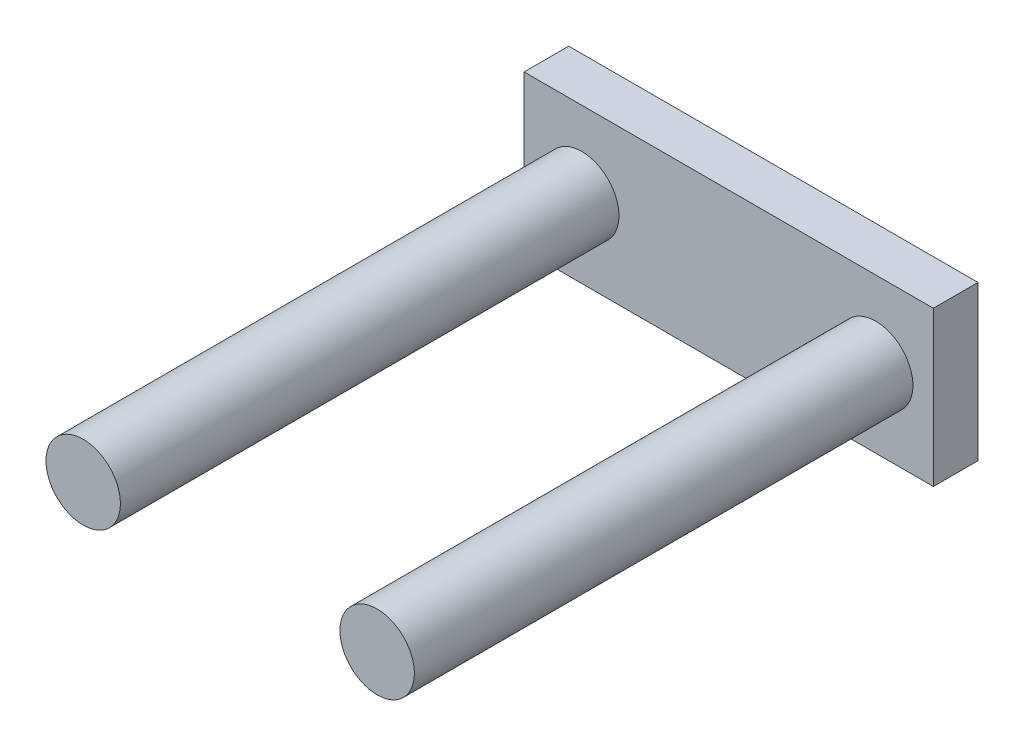
ISO-10303-21;
HEADER;
FILE_DESCRIPTION(('STEP AP214'),'2;1');
FILE_NAME('part.step','',(''),(''),'','','');
FILE_SCHEMA(('AUTOMOTIVE_DESIGN { 1 0 10303 214 1 1 1 1 }'));
ENDSEC;
DATA;
#1=APPLICATION_CONTEXT('core data for automotive mechanical design processes');
#2=APPLICATION_PROTOCOL_DEFINITION('international standard','automotive_design',2000,#1);
#3=PRODUCT_CONTEXT('',#1,'mechanical');
#4=PRODUCT('Part','Part','',(#3));
#5=PRODUCT_RELATED_PRODUCT_CATEGORY('part','',(#4));
#6=PRODUCT_DEFINITION_FORMATION('','',#4);
#7=PRODUCT_DEFINITION_CONTEXT('part definition',#1,'design');
#8=PRODUCT_DEFINITION('design','',#6,#7);
#9=PRODUCT_DEFINITION_SHAPE('','',#8);
#10=(LENGTH_UNIT() NAMED_UNIT(*) SI_UNIT(.MILLI.,.METRE.));
#11=(NAMED_UNIT(*) PLANE_ANGLE_UNIT() SI_UNIT($,.RADIAN.));
#12=(NAMED_UNIT(*) SI_UNIT($,.STERADIAN.) SOLID_ANGLE_UNIT());
#13=UNCERTAINTY_MEASURE_WITH_UNIT(LENGTH_MEASURE(1.E-05),#10,'distance_accuracy_value','');
#14=(GEOMETRIC_REPRESENTATION_CONTEXT(3) GLOBAL_UNCERTAINTY_ASSIGNED_CONTEXT((#13)) GLOBAL_UNIT_ASSIGNED_CONTEXT((#10,
#11,#12)) REPRESENTATION_CONTEXT('',''));
#15=CARTESIAN_POINT('',(0.,0.,0.));
#16=DIRECTION('',(0.,0.,1.));
#17=DIRECTION('',(1.,0.,0.));
#18=AXIS2_PLACEMENT_3D('',#15,#16,#17);
#19=CARTESIAN_POINT('',(55.,-20.75,12.));
#20=DIRECTION('',(-1.,0.,0.));
#21=DIRECTION('',(0.,0.,1.));
#22=AXIS2_PLACEMENT_3D('',#19,#20,#21);
#23=PLANE('',#22);
#24=DIRECTION('',(0.,1.,0.));
#25=VECTOR('',#24,1.);
#26=CARTESIAN_POINT('',(55.,-20.75,0.));
#27=LINE('',#26,#25);
#28=CARTESIAN_POINT('',(55.,-20.75,0.));
#29=VERTEX_POINT('',#28);
#30=CARTESIAN_POINT('',(55.,20.75,0.));
#31=VERTEX_POINT('',#30);
#32=EDGE_CURVE('E100',#29,#31,#27,.T.);
#33=ORIENTED_EDGE('',*,*,#32,.T.);
#34=DIRECTION('',(0.,0.,-1.));
#35=VECTOR('',#34,1.);
#36=CARTESIAN_POINT('',(55.,20.75,12.));
#37=LINE('',#36,#35);
#38=CARTESIAN_POINT('',(55.,20.75,12.));
#39=VERTEX_POINT('',#38);
#40=EDGE_CURVE('E91',#39,#31,#37,.T.);
#41=ORIENTED_EDGE('',*,*,#40,.F.);
#42=DIRECTION('',(0.,1.,0.));
#43=VECTOR('',#42,1.);
#44=CARTESIAN_POINT('',(55.,-20.75,12.));
#45=LINE('',#44,#43);
#46=CARTESIAN_POINT('',(55.,-20.75,12.));
#47=VERTEX_POINT('',#46);
#48=EDGE_CURVE('E85',#47,#39,#45,.T.);
#49=ORIENTED_EDGE('',*,*,#48,.F.);
#50=DIRECTION('',(0.,0.,-1.));
#51=VECTOR('',#50,1.);
#52=CARTESIAN_POINT('',(55.,-20.75,12.));
#53=LINE('',#52,#51);
#54=EDGE_CURVE('E96',#47,#29,#53,.T.);
#55=ORIENTED_EDGE('',*,*,#54,.T.);
#56=EDGE_LOOP('',(#33,#41,#49,#55));
#57=FACE_BOUND('',#56,.T.);
#58=ADVANCED_FACE('F33',(#57),#23,.F.);
#59=CARTESIAN_POINT('',(-55.,20.75,12.));
#60=DIRECTION('',(0.,-1.,0.));
#61=DIRECTION('',(0.,0.,-1.));
#62=AXIS2_PLACEMENT_3D('',#59,#60,#61);
#63=PLANE('',#62);
#64=DIRECTION('',(-1.,0.,0.));
#65=VECTOR('',#64,1.);
#66=CARTESIAN_POINT('',(-55.,20.75,0.));
#67=LINE('',#66,#65);
#68=CARTESIAN_POINT('',(-55.,20.75,0.));
#69=VERTEX_POINT('',#68);
#70=EDGE_CURVE('E90',#31,#69,#67,.T.);
#71=ORIENTED_EDGE('',*,*,#70,.T.);
#72=DIRECTION('',(0.,0.,-1.));
#73=VECTOR('',#72,1.);
#74=CARTESIAN_POINT('',(-55.,20.75,12.));
#75=LINE('',#74,#73);
#76=CARTESIAN_POINT('',(-55.,20.75,12.));
#77=VERTEX_POINT('',#76);
#78=EDGE_CURVE('E88',#77,#69,#75,.T.);
#79=ORIENTED_EDGE('',*,*,#78,.F.);
#80=DIRECTION('',(-1.,0.,0.));
#81=VECTOR('',#80,1.);
#82=CARTESIAN_POINT('',(-55.,20.75,12.));
#83=LINE('',#82,#81);
#84=EDGE_CURVE('E80',#39,#77,#83,.T.);
#85=ORIENTED_EDGE('',*,*,#84,.F.);
#86=ORIENTED_EDGE('',*,*,#40,.T.);
#87=EDGE_LOOP('',(#71,#79,#85,#86));
#88=FACE_BOUND('',#87,.T.);
#89=ADVANCED_FACE('F89',(#88),#63,.F.);
#90=CARTESIAN_POINT('',(-55.,-20.75,12.));
#91=DIRECTION('',(1.,0.,0.));
#92=DIRECTION('',(0.,0.,-1.));
#93=AXIS2_PLACEMENT_3D('',#90,#91,#92);
#94=PLANE('',#93);
#95=DIRECTION('',(0.,-1.,0.));
#96=VECTOR('',#95,1.);
#97=CARTESIAN_POINT('',(-55.,-20.75,0.));
#98=LINE('',#97,#96);
#99=CARTESIAN_POINT('',(-55.,-20.75,0.));
#100=VERTEX_POINT('',#99);
#101=EDGE_CURVE('E66',#69,#100,#98,.T.);
#102=ORIENTED_EDGE('',*,*,#101,.T.);
#103=DIRECTION('',(0.,0.,-1.));
#104=VECTOR('',#103,1.);
#105=CARTESIAN_POINT('',(-55.,-20.75,12.));
#106=LINE('',#105,#104);
#107=CARTESIAN_POINT('',(-55.,-20.75,12.));
#108=VERTEX_POINT('',#107);
#109=EDGE_CURVE('E92',#108,#100,#106,.T.);
#110=ORIENTED_EDGE('',*,*,#109,.F.);
#111=DIRECTION('',(0.,-1.,0.));
#112=VECTOR('',#111,1.);
#113=CARTESIAN_POINT('',(-55.,-20.75,12.));
#114=LINE('',#113,#112);
#115=EDGE_CURVE('E83',#77,#108,#114,.T.);
#116=ORIENTED_EDGE('',*,*,#115,.F.);
#117=ORIENTED_EDGE('',*,*,#78,.T.);
#118=EDGE_LOOP('',(#102,#110,#116,#117));
#119=FACE_BOUND('',#118,.T.);
#120=ADVANCED_FACE('F94',(#119),#94,.F.);
#121=CARTESIAN_POINT('',(-55.,-20.75,12.));
#122=DIRECTION('',(0.,1.,0.));
#123=DIRECTION('',(0.,0.,1.));
#124=AXIS2_PLACEMENT_3D('',#121,#122,#123);
#125=PLANE('',#124);
#126=DIRECTION('',(1.,0.,0.));
#127=VECTOR('',#126,1.);
#128=CARTESIAN_POINT('',(-55.,-20.75,0.));
#129=LINE('',#128,#127);
#130=EDGE_CURVE('E72',#100,#29,#129,.T.);
#131=ORIENTED_EDGE('',*,*,#130,.T.);
#132=ORIENTED_EDGE('',*,*,#54,.F.);
#133=DIRECTION('',(1.,0.,0.));
#134=VECTOR('',#133,1.);
#135=CARTESIAN_POINT('',(-55.,-20.75,12.));
#136=LINE('',#135,#134);
#137=EDGE_CURVE('E49',#108,#47,#136,.T.);
#138=ORIENTED_EDGE('',*,*,#137,.F.);
#139=ORIENTED_EDGE('',*,*,#109,.T.);
#140=EDGE_LOOP('',(#131,#132,#138,#139));
#141=FACE_BOUND('',#140,.T.);
#142=ADVANCED_FACE('F116',(#141),#125,.F.);
#143=CARTESIAN_POINT('',(0.,0.,12.));
#144=DIRECTION('',(0.,0.,-1.));
#145=DIRECTION('',(-1.,0.,0.));
#146=AXIS2_PLACEMENT_3D('',#143,#144,#145);
#147=PLANE('',#146);
#148=CARTESIAN_POINT('',(39.5,0.,12.));
#149=DIRECTION('',(0.,0.,-1.));
#150=DIRECTION('',(-1.,0.,0.));
#151=AXIS2_PLACEMENT_3D('',#148,#149,#150);
#152=CIRCLE('',#151,10.);
#153=CARTESIAN_POINT('',(29.5,0.,12.));
#154=VERTEX_POINT('',#153);
#155=EDGE_CURVE('E11',#154,#154,#152,.F.);
#156=ORIENTED_EDGE('',*,*,#155,.F.);
#157=EDGE_LOOP('',(#156));
#158=FACE_BOUND('',#157,.T.);
#159=CARTESIAN_POINT('',(-39.5,0.,12.));
#160=DIRECTION('',(0.,0.,-1.));
#161=DIRECTION('',(-1.,0.,0.));
#162=AXIS2_PLACEMENT_3D('',#159,#160,#161);
#163=CIRCLE('',#162,10.);
#164=CARTESIAN_POINT('',(-49.5,0.,12.));
#165=VERTEX_POINT('',#164);
#166=EDGE_CURVE('E41',#165,#165,#163,.F.);
#167=ORIENTED_EDGE('',*,*,#166,.F.);
#168=EDGE_LOOP('',(#167));
#169=FACE_BOUND('',#168,.T.);
#170=ORIENTED_EDGE('',*,*,#48,.T.);
#171=ORIENTED_EDGE('',*,*,#84,.T.);
#172=ORIENTED_EDGE('',*,*,#115,.T.);
#173=ORIENTED_EDGE('',*,*,#137,.T.);
#174=EDGE_LOOP('',(#170,#171,#172,#173));
#175=FACE_BOUND('',#174,.T.);
#176=ADVANCED_FACE('F81',(#158,#169,#175),#147,.F.);
#177=CARTESIAN_POINT('',(0.,0.,0.));
#178=DIRECTION('',(0.,0.,-1.));
#179=DIRECTION('',(-1.,0.,0.));
#180=AXIS2_PLACEMENT_3D('',#177,#178,#179);
#181=PLANE('',#180);
#182=ORIENTED_EDGE('',*,*,#32,.F.);
#183=ORIENTED_EDGE('',*,*,#130,.F.);
#184=ORIENTED_EDGE('',*,*,#101,.F.);
#185=ORIENTED_EDGE('',*,*,#70,.F.);
#186=EDGE_LOOP('',(#182,#183,#184,#185));
#187=FACE_BOUND('',#186,.T.);
#188=ADVANCED_FACE('F115',(#187),#181,.T.);
#189=CARTESIAN_POINT('',(-39.5,0.,146.));
#190=DIRECTION('',(0.,0.,-1.));
#191=DIRECTION('',(-1.,0.,0.));
#192=AXIS2_PLACEMENT_3D('',#189,#190,#191);
#193=CYLINDRICAL_SURFACE('',#192,10.);
#194=CARTESIAN_POINT('',(-39.5,0.,146.));
#195=DIRECTION('',(0.,0.,1.));
#196=DIRECTION('',(1.,0.,0.));
#197=AXIS2_PLACEMENT_3D('',#194,#195,#196);
#198=CIRCLE('',#197,10.);
#199=CARTESIAN_POINT('',(-29.5,0.,146.));
#200=VERTEX_POINT('',#199);
#201=EDGE_CURVE('E103',#200,#200,#198,.T.);
#202=ORIENTED_EDGE('',*,*,#201,.F.);
#203=EDGE_LOOP('',(#202));
#204=FACE_BOUND('',#203,.T.);
#205=ORIENTED_EDGE('',*,*,#166,.T.);
#206=EDGE_LOOP('',(#205));
#207=FACE_BOUND('',#206,.T.);
#208=ADVANCED_FACE('F112',(#204,#207),#193,.T.);
#209=CARTESIAN_POINT('',(-39.5,0.,146.));
#210=DIRECTION('',(0.,0.,1.));
#211=DIRECTION('',(1.,0.,0.));
#212=AXIS2_PLACEMENT_3D('',#209,#210,#211);
#213=PLANE('',#212);
#214=ORIENTED_EDGE('',*,*,#201,.T.);
#215=EDGE_LOOP('',(#214));
#216=FACE_BOUND('',#215,.T.);
#217=ADVANCED_FACE('F146',(#216),#213,.T.);
#218=CARTESIAN_POINT('',(39.5,0.,146.));
#219=DIRECTION('',(0.,0.,-1.));
#220=DIRECTION('',(-1.,0.,0.));
#221=AXIS2_PLACEMENT_3D('',#218,#219,#220);
#222=CYLINDRICAL_SURFACE('',#221,10.);
#223=CARTESIAN_POINT('',(39.5,0.,146.));
#224=DIRECTION('',(0.,0.,1.));
#225=DIRECTION('',(-1.,0.,0.));
#226=AXIS2_PLACEMENT_3D('',#223,#224,#225);
#227=CIRCLE('',#226,10.);
#228=CARTESIAN_POINT('',(29.5,0.,146.));
#229=VERTEX_POINT('',#228);
#230=EDGE_CURVE('E137',#229,#229,#227,.T.);
#231=ORIENTED_EDGE('',*,*,#230,.F.);
#232=EDGE_LOOP('',(#231));
#233=FACE_BOUND('',#232,.T.);
#234=ORIENTED_EDGE('',*,*,#155,.T.);
#235=EDGE_LOOP('',(#234));
#236=FACE_BOUND('',#235,.T.);
#237=ADVANCED_FACE('F143',(#233,#236),#222,.T.);
#238=CARTESIAN_POINT('',(39.5,0.,146.));
#239=DIRECTION('',(0.,0.,-1.));
#240=DIRECTION('',(-1.,0.,0.));
#241=AXIS2_PLACEMENT_3D('',#238,#239,#240);
#242=PLANE('',#241);
#243=ORIENTED_EDGE('',*,*,#230,.T.);
#244=EDGE_LOOP('',(#243));
#245=FACE_BOUND('',#244,.T.);
#246=ADVANCED_FACE('F141',(#245),#242,.F.);
#247=CLOSED_SHELL('',(#58,#89,#120,#142,#176,#188,#208,#217,#237,#246));
#248=MANIFOLD_SOLID_BREP('B2',#247);
#249=ADVANCED_BREP_SHAPE_REPRESENTATION('',(#18,#248),#14);
#250=SHAPE_DEFINITION_REPRESENTATION(#9,#249);
ENDSEC;
END-ISO-10303-21;
